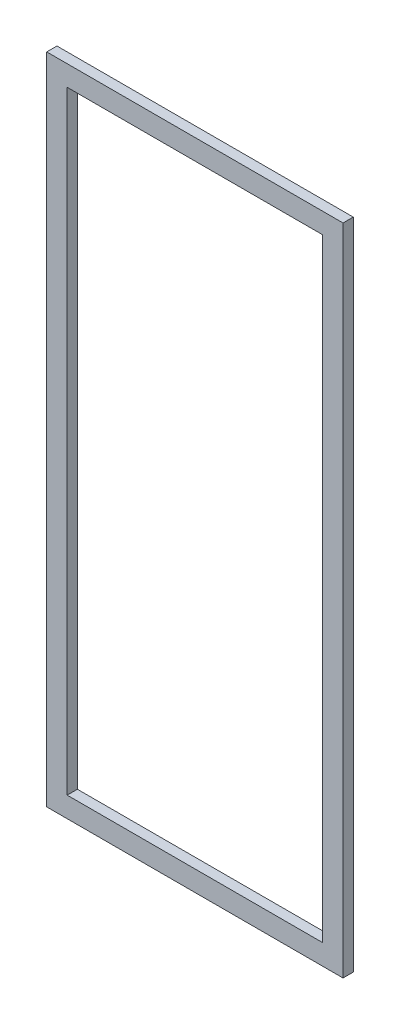
ISO-10303-21;
HEADER;
FILE_DESCRIPTION(('STEP AP214'),'2;1');
FILE_NAME('part.step','',(''),(''),'','','');
FILE_SCHEMA(('AUTOMOTIVE_DESIGN { 1 0 10303 214 1 1 1 1 }'));
ENDSEC;
DATA;
#1=APPLICATION_CONTEXT('core data for automotive mechanical design processes');
#2=APPLICATION_PROTOCOL_DEFINITION('international standard','automotive_design',2000,#1);
#3=PRODUCT_CONTEXT('',#1,'mechanical');
#4=PRODUCT('Part','Part','',(#3));
#5=PRODUCT_RELATED_PRODUCT_CATEGORY('part','',(#4));
#6=PRODUCT_DEFINITION_FORMATION('','',#4);
#7=PRODUCT_DEFINITION_CONTEXT('part definition',#1,'design');
#8=PRODUCT_DEFINITION('design','',#6,#7);
#9=PRODUCT_DEFINITION_SHAPE('','',#8);
#10=(LENGTH_UNIT() NAMED_UNIT(*) SI_UNIT(.MILLI.,.METRE.));
#11=(NAMED_UNIT(*) PLANE_ANGLE_UNIT() SI_UNIT($,.RADIAN.));
#12=(NAMED_UNIT(*) SI_UNIT($,.STERADIAN.) SOLID_ANGLE_UNIT());
#13=UNCERTAINTY_MEASURE_WITH_UNIT(LENGTH_MEASURE(1.E-05),#10,'distance_accuracy_value','');
#14=(GEOMETRIC_REPRESENTATION_CONTEXT(3) GLOBAL_UNCERTAINTY_ASSIGNED_CONTEXT((#13)) GLOBAL_UNIT_ASSIGNED_CONTEXT((#10,
#11,#12)) REPRESENTATION_CONTEXT('',''));
#15=CARTESIAN_POINT('',(0.,0.,0.));
#16=DIRECTION('',(0.,0.,1.));
#17=DIRECTION('',(1.,0.,0.));
#18=AXIS2_PLACEMENT_3D('',#15,#16,#17);
#19=CARTESIAN_POINT('',(-14.5,-32.,-1.));
#20=DIRECTION('',(-1.,0.,0.));
#21=DIRECTION('',(0.,0.,1.));
#22=AXIS2_PLACEMENT_3D('',#19,#20,#21);
#23=PLANE('',#22);
#24=DIRECTION('',(0.,-1.,0.));
#25=VECTOR('',#24,1.);
#26=CARTESIAN_POINT('',(-14.5,-32.,0.));
#27=LINE('',#26,#25);
#28=CARTESIAN_POINT('',(-14.5,32.,0.));
#29=VERTEX_POINT('',#28);
#30=CARTESIAN_POINT('',(-14.5,-32.,0.));
#31=VERTEX_POINT('',#30);
#32=EDGE_CURVE('E132',#29,#31,#27,.T.);
#33=ORIENTED_EDGE('',*,*,#32,.F.);
#34=DIRECTION('',(0.,0.,1.));
#35=VECTOR('',#34,1.);
#36=CARTESIAN_POINT('',(-14.5,32.,-1.));
#37=LINE('',#36,#35);
#38=CARTESIAN_POINT('',(-14.5,32.,-1.));
#39=VERTEX_POINT('',#38);
#40=EDGE_CURVE('E11',#39,#29,#37,.T.);
#41=ORIENTED_EDGE('',*,*,#40,.F.);
#42=DIRECTION('',(0.,-1.,0.));
#43=VECTOR('',#42,1.);
#44=CARTESIAN_POINT('',(-14.5,-32.,-1.));
#45=LINE('',#44,#43);
#46=CARTESIAN_POINT('',(-14.5,-32.,-1.));
#47=VERTEX_POINT('',#46);
#48=EDGE_CURVE('E136',#39,#47,#45,.T.);
#49=ORIENTED_EDGE('',*,*,#48,.T.);
#50=DIRECTION('',(0.,0.,1.));
#51=VECTOR('',#50,1.);
#52=CARTESIAN_POINT('',(-14.5,-32.,-1.));
#53=LINE('',#52,#51);
#54=EDGE_CURVE('E39',#47,#31,#53,.T.);
#55=ORIENTED_EDGE('',*,*,#54,.T.);
#56=EDGE_LOOP('',(#33,#41,#49,#55));
#57=FACE_BOUND('',#56,.T.);
#58=ADVANCED_FACE('F36',(#57),#23,.T.);
#59=CARTESIAN_POINT('',(-14.5,32.,-1.));
#60=DIRECTION('',(0.,1.,0.));
#61=DIRECTION('',(0.,0.,1.));
#62=AXIS2_PLACEMENT_3D('',#59,#60,#61);
#63=PLANE('',#62);
#64=DIRECTION('',(-1.,0.,0.));
#65=VECTOR('',#64,1.);
#66=CARTESIAN_POINT('',(-14.5,32.,0.));
#67=LINE('',#66,#65);
#68=CARTESIAN_POINT('',(14.5,32.,0.));
#69=VERTEX_POINT('',#68);
#70=EDGE_CURVE('E140',#69,#29,#67,.T.);
#71=ORIENTED_EDGE('',*,*,#70,.F.);
#72=DIRECTION('',(0.,0.,1.));
#73=VECTOR('',#72,1.);
#74=CARTESIAN_POINT('',(14.5,32.,-1.));
#75=LINE('',#74,#73);
#76=CARTESIAN_POINT('',(14.5,32.,-1.));
#77=VERTEX_POINT('',#76);
#78=EDGE_CURVE('E44',#77,#69,#75,.T.);
#79=ORIENTED_EDGE('',*,*,#78,.F.);
#80=DIRECTION('',(-1.,0.,0.));
#81=VECTOR('',#80,1.);
#82=CARTESIAN_POINT('',(-14.5,32.,-1.));
#83=LINE('',#82,#81);
#84=EDGE_CURVE('E146',#77,#39,#83,.T.);
#85=ORIENTED_EDGE('',*,*,#84,.T.);
#86=ORIENTED_EDGE('',*,*,#40,.T.);
#87=EDGE_LOOP('',(#71,#79,#85,#86));
#88=FACE_BOUND('',#87,.T.);
#89=ADVANCED_FACE('F172',(#88),#63,.T.);
#90=CARTESIAN_POINT('',(14.5,-32.,-1.));
#91=DIRECTION('',(1.,0.,0.));
#92=DIRECTION('',(0.,0.,-1.));
#93=AXIS2_PLACEMENT_3D('',#90,#91,#92);
#94=PLANE('',#93);
#95=DIRECTION('',(0.,1.,0.));
#96=VECTOR('',#95,1.);
#97=CARTESIAN_POINT('',(14.5,-32.,0.));
#98=LINE('',#97,#96);
#99=CARTESIAN_POINT('',(14.5,-32.,0.));
#100=VERTEX_POINT('',#99);
#101=EDGE_CURVE('E154',#100,#69,#98,.T.);
#102=ORIENTED_EDGE('',*,*,#101,.F.);
#103=DIRECTION('',(0.,0.,1.));
#104=VECTOR('',#103,1.);
#105=CARTESIAN_POINT('',(14.5,-32.,-1.));
#106=LINE('',#105,#104);
#107=CARTESIAN_POINT('',(14.5,-32.,-1.));
#108=VERTEX_POINT('',#107);
#109=EDGE_CURVE('E159',#108,#100,#106,.T.);
#110=ORIENTED_EDGE('',*,*,#109,.F.);
#111=DIRECTION('',(0.,1.,0.));
#112=VECTOR('',#111,1.);
#113=CARTESIAN_POINT('',(14.5,-32.,-1.));
#114=LINE('',#113,#112);
#115=EDGE_CURVE('E143',#108,#77,#114,.T.);
#116=ORIENTED_EDGE('',*,*,#115,.T.);
#117=ORIENTED_EDGE('',*,*,#78,.T.);
#118=EDGE_LOOP('',(#102,#110,#116,#117));
#119=FACE_BOUND('',#118,.T.);
#120=ADVANCED_FACE('F176',(#119),#94,.T.);
#121=CARTESIAN_POINT('',(-14.5,-32.,-1.));
#122=DIRECTION('',(0.,-1.,0.));
#123=DIRECTION('',(0.,0.,-1.));
#124=AXIS2_PLACEMENT_3D('',#121,#122,#123);
#125=PLANE('',#124);
#126=DIRECTION('',(1.,0.,0.));
#127=VECTOR('',#126,1.);
#128=CARTESIAN_POINT('',(-14.5,-32.,0.));
#129=LINE('',#128,#127);
#130=EDGE_CURVE('E151',#31,#100,#129,.T.);
#131=ORIENTED_EDGE('',*,*,#130,.F.);
#132=ORIENTED_EDGE('',*,*,#54,.F.);
#133=DIRECTION('',(1.,0.,0.));
#134=VECTOR('',#133,1.);
#135=CARTESIAN_POINT('',(-14.5,-32.,-1.));
#136=LINE('',#135,#134);
#137=EDGE_CURVE('E139',#47,#108,#136,.T.);
#138=ORIENTED_EDGE('',*,*,#137,.T.);
#139=ORIENTED_EDGE('',*,*,#109,.T.);
#140=EDGE_LOOP('',(#131,#132,#138,#139));
#141=FACE_BOUND('',#140,.T.);
#142=ADVANCED_FACE('F167',(#141),#125,.T.);
#143=CARTESIAN_POINT('',(0.,0.,-1.));
#144=DIRECTION('',(0.,0.,-1.));
#145=DIRECTION('',(-1.,0.,0.));
#146=AXIS2_PLACEMENT_3D('',#143,#144,#145);
#147=PLANE('',#146);
#148=DIRECTION('',(1.,0.,0.));
#149=VECTOR('',#148,1.);
#150=CARTESIAN_POINT('',(0.,-30.,-1.));
#151=LINE('',#150,#149);
#152=CARTESIAN_POINT('',(-12.5,-30.,-1.));
#153=VERTEX_POINT('',#152);
#154=CARTESIAN_POINT('',(12.5,-30.,-1.));
#155=VERTEX_POINT('',#154);
#156=EDGE_CURVE('E103',#153,#155,#151,.T.);
#157=ORIENTED_EDGE('',*,*,#156,.T.);
#158=DIRECTION('',(0.,1.,0.));
#159=VECTOR('',#158,1.);
#160=CARTESIAN_POINT('',(12.5,0.,-1.));
#161=LINE('',#160,#159);
#162=CARTESIAN_POINT('',(12.5,30.,-1.));
#163=VERTEX_POINT('',#162);
#164=EDGE_CURVE('E109',#155,#163,#161,.T.);
#165=ORIENTED_EDGE('',*,*,#164,.T.);
#166=DIRECTION('',(1.,0.,0.));
#167=VECTOR('',#166,1.);
#168=CARTESIAN_POINT('',(0.,30.,-1.));
#169=LINE('',#168,#167);
#170=CARTESIAN_POINT('',(-12.5,30.,-1.));
#171=VERTEX_POINT('',#170);
#172=EDGE_CURVE('E113',#171,#163,#169,.T.);
#173=ORIENTED_EDGE('',*,*,#172,.F.);
#174=DIRECTION('',(0.,1.,0.));
#175=VECTOR('',#174,1.);
#176=CARTESIAN_POINT('',(-12.5,0.,-1.));
#177=LINE('',#176,#175);
#178=EDGE_CURVE('E106',#153,#171,#177,.T.);
#179=ORIENTED_EDGE('',*,*,#178,.F.);
#180=EDGE_LOOP('',(#157,#165,#173,#179));
#181=FACE_BOUND('',#180,.T.);
#182=ORIENTED_EDGE('',*,*,#48,.F.);
#183=ORIENTED_EDGE('',*,*,#84,.F.);
#184=ORIENTED_EDGE('',*,*,#115,.F.);
#185=ORIENTED_EDGE('',*,*,#137,.F.);
#186=EDGE_LOOP('',(#182,#183,#184,#185));
#187=FACE_BOUND('',#186,.T.);
#188=ADVANCED_FACE('F115',(#181,#187),#147,.T.);
#189=CARTESIAN_POINT('',(0.,0.,0.));
#190=DIRECTION('',(0.,0.,-1.));
#191=DIRECTION('',(-1.,0.,0.));
#192=AXIS2_PLACEMENT_3D('',#189,#190,#191);
#193=PLANE('',#192);
#194=DIRECTION('',(0.,1.,0.));
#195=VECTOR('',#194,1.);
#196=CARTESIAN_POINT('',(12.5,0.,0.));
#197=LINE('',#196,#195);
#198=CARTESIAN_POINT('',(12.5,-30.,0.));
#199=VERTEX_POINT('',#198);
#200=CARTESIAN_POINT('',(12.5,30.,0.));
#201=VERTEX_POINT('',#200);
#202=EDGE_CURVE('E126',#199,#201,#197,.T.);
#203=ORIENTED_EDGE('',*,*,#202,.F.);
#204=DIRECTION('',(1.,0.,0.));
#205=VECTOR('',#204,1.);
#206=CARTESIAN_POINT('',(0.,-30.,0.));
#207=LINE('',#206,#205);
#208=CARTESIAN_POINT('',(-12.5,-30.,0.));
#209=VERTEX_POINT('',#208);
#210=EDGE_CURVE('E60',#209,#199,#207,.T.);
#211=ORIENTED_EDGE('',*,*,#210,.F.);
#212=DIRECTION('',(0.,1.,0.));
#213=VECTOR('',#212,1.);
#214=CARTESIAN_POINT('',(-12.5,0.,0.));
#215=LINE('',#214,#213);
#216=CARTESIAN_POINT('',(-12.5,30.,0.));
#217=VERTEX_POINT('',#216);
#218=EDGE_CURVE('E117',#209,#217,#215,.T.);
#219=ORIENTED_EDGE('',*,*,#218,.T.);
#220=DIRECTION('',(1.,0.,0.));
#221=VECTOR('',#220,1.);
#222=CARTESIAN_POINT('',(0.,30.,0.));
#223=LINE('',#222,#221);
#224=EDGE_CURVE('E120',#217,#201,#223,.T.);
#225=ORIENTED_EDGE('',*,*,#224,.T.);
#226=EDGE_LOOP('',(#203,#211,#219,#225));
#227=FACE_BOUND('',#226,.T.);
#228=ORIENTED_EDGE('',*,*,#32,.T.);
#229=ORIENTED_EDGE('',*,*,#130,.T.);
#230=ORIENTED_EDGE('',*,*,#101,.T.);
#231=ORIENTED_EDGE('',*,*,#70,.T.);
#232=EDGE_LOOP('',(#228,#229,#230,#231));
#233=FACE_BOUND('',#232,.T.);
#234=ADVANCED_FACE('F169',(#227,#233),#193,.F.);
#235=CARTESIAN_POINT('',(0.,-30.,-1.));
#236=DIRECTION('',(0.,-1.,0.));
#237=DIRECTION('',(0.,0.,-1.));
#238=AXIS2_PLACEMENT_3D('',#235,#236,#237);
#239=PLANE('',#238);
#240=ORIENTED_EDGE('',*,*,#210,.T.);
#241=DIRECTION('',(0.,0.,1.));
#242=VECTOR('',#241,1.);
#243=CARTESIAN_POINT('',(12.5,-30.,-1.));
#244=LINE('',#243,#242);
#245=EDGE_CURVE('E100',#155,#199,#244,.T.);
#246=ORIENTED_EDGE('',*,*,#245,.F.);
#247=ORIENTED_EDGE('',*,*,#156,.F.);
#248=DIRECTION('',(0.,0.,1.));
#249=VECTOR('',#248,1.);
#250=CARTESIAN_POINT('',(-12.5,-30.,-1.));
#251=LINE('',#250,#249);
#252=EDGE_CURVE('E130',#153,#209,#251,.T.);
#253=ORIENTED_EDGE('',*,*,#252,.T.);
#254=EDGE_LOOP('',(#240,#246,#247,#253));
#255=FACE_BOUND('',#254,.T.);
#256=ADVANCED_FACE('F101',(#255),#239,.F.);
#257=CARTESIAN_POINT('',(-12.5,0.,-1.));
#258=DIRECTION('',(1.,0.,0.));
#259=DIRECTION('',(0.,0.,-1.));
#260=AXIS2_PLACEMENT_3D('',#257,#258,#259);
#261=PLANE('',#260);
#262=ORIENTED_EDGE('',*,*,#218,.F.);
#263=ORIENTED_EDGE('',*,*,#252,.F.);
#264=ORIENTED_EDGE('',*,*,#178,.T.);
#265=DIRECTION('',(0.,0.,1.));
#266=VECTOR('',#265,1.);
#267=CARTESIAN_POINT('',(-12.5,30.,-1.));
#268=LINE('',#267,#266);
#269=EDGE_CURVE('E133',#171,#217,#268,.T.);
#270=ORIENTED_EDGE('',*,*,#269,.T.);
#271=EDGE_LOOP('',(#262,#263,#264,#270));
#272=FACE_BOUND('',#271,.T.);
#273=ADVANCED_FACE('F232',(#272),#261,.T.);
#274=CARTESIAN_POINT('',(0.,30.,-1.));
#275=DIRECTION('',(0.,-1.,0.));
#276=DIRECTION('',(0.,0.,-1.));
#277=AXIS2_PLACEMENT_3D('',#274,#275,#276);
#278=PLANE('',#277);
#279=ORIENTED_EDGE('',*,*,#224,.F.);
#280=ORIENTED_EDGE('',*,*,#269,.F.);
#281=ORIENTED_EDGE('',*,*,#172,.T.);
#282=DIRECTION('',(0.,0.,1.));
#283=VECTOR('',#282,1.);
#284=CARTESIAN_POINT('',(12.5,30.,-1.));
#285=LINE('',#284,#283);
#286=EDGE_CURVE('E52',#163,#201,#285,.T.);
#287=ORIENTED_EDGE('',*,*,#286,.T.);
#288=EDGE_LOOP('',(#279,#280,#281,#287));
#289=FACE_BOUND('',#288,.T.);
#290=ADVANCED_FACE('F242',(#289),#278,.T.);
#291=CARTESIAN_POINT('',(12.5,0.,-1.));
#292=DIRECTION('',(1.,0.,0.));
#293=DIRECTION('',(0.,0.,-1.));
#294=AXIS2_PLACEMENT_3D('',#291,#292,#293);
#295=PLANE('',#294);
#296=ORIENTED_EDGE('',*,*,#202,.T.);
#297=ORIENTED_EDGE('',*,*,#286,.F.);
#298=ORIENTED_EDGE('',*,*,#164,.F.);
#299=ORIENTED_EDGE('',*,*,#245,.T.);
#300=EDGE_LOOP('',(#296,#297,#298,#299));
#301=FACE_BOUND('',#300,.T.);
#302=ADVANCED_FACE('F110',(#301),#295,.F.);
#303=CLOSED_SHELL('',(#58,#89,#120,#142,#188,#234,#256,#273,#290,#302));
#304=MANIFOLD_SOLID_BREP('B2',#303);
#305=ADVANCED_BREP_SHAPE_REPRESENTATION('',(#18,#304),#14);
#306=SHAPE_DEFINITION_REPRESENTATION(#9,#305);
ENDSEC;
END-ISO-10303-21;
